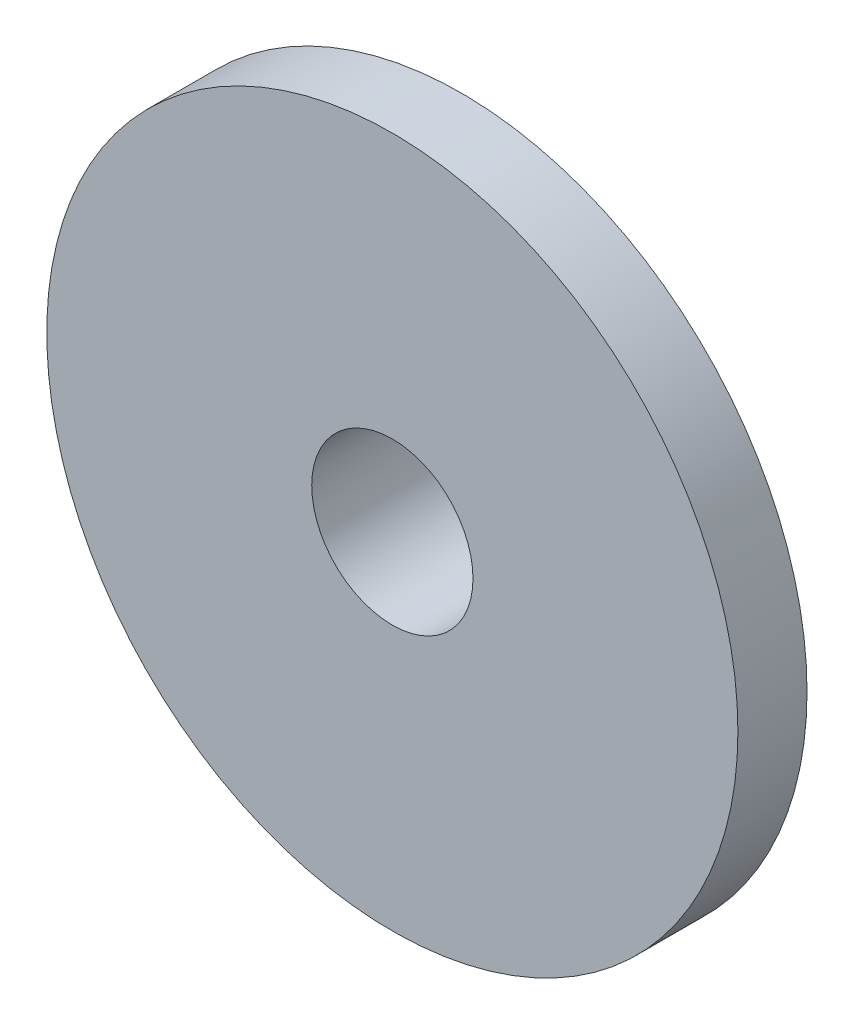
ISO-10303-21;
HEADER;
FILE_DESCRIPTION(('STEP AP214'),'2;1');
FILE_NAME('part.step','',(''),(''),'','','');
FILE_SCHEMA(('AUTOMOTIVE_DESIGN { 1 0 10303 214 1 1 1 1 }'));
ENDSEC;
DATA;
#1=APPLICATION_CONTEXT('core data for automotive mechanical design processes');
#2=APPLICATION_PROTOCOL_DEFINITION('international standard','automotive_design',2000,#1);
#3=PRODUCT_CONTEXT('',#1,'mechanical');
#4=PRODUCT('Part','Part','',(#3));
#5=PRODUCT_RELATED_PRODUCT_CATEGORY('part','',(#4));
#6=PRODUCT_DEFINITION_FORMATION('','',#4);
#7=PRODUCT_DEFINITION_CONTEXT('part definition',#1,'design');
#8=PRODUCT_DEFINITION('design','',#6,#7);
#9=PRODUCT_DEFINITION_SHAPE('','',#8);
#10=(LENGTH_UNIT() NAMED_UNIT(*) SI_UNIT(.MILLI.,.METRE.));
#11=(NAMED_UNIT(*) PLANE_ANGLE_UNIT() SI_UNIT($,.RADIAN.));
#12=(NAMED_UNIT(*) SI_UNIT($,.STERADIAN.) SOLID_ANGLE_UNIT());
#13=UNCERTAINTY_MEASURE_WITH_UNIT(LENGTH_MEASURE(1.E-05),#10,'distance_accuracy_value','');
#14=(GEOMETRIC_REPRESENTATION_CONTEXT(3) GLOBAL_UNCERTAINTY_ASSIGNED_CONTEXT((#13)) GLOBAL_UNIT_ASSIGNED_CONTEXT((#10,
#11,#12)) REPRESENTATION_CONTEXT('',''));
#15=CARTESIAN_POINT('',(0.,0.,0.));
#16=DIRECTION('',(0.,0.,1.));
#17=DIRECTION('',(1.,0.,0.));
#18=AXIS2_PLACEMENT_3D('',#15,#16,#17);
#19=CARTESIAN_POINT('',(-0.860205171589579,39.9907495186422,0.));
#20=DIRECTION('',(0.,0.,1.));
#21=DIRECTION('',(1.,0.,0.));
#22=AXIS2_PLACEMENT_3D('',#19,#20,#21);
#23=PLANE('',#22);
#24=CARTESIAN_POINT('',(-0.860205171589579,39.9907495186422,0.));
#25=DIRECTION('',(0.,0.,1.));
#26=DIRECTION('',(1.,0.,0.));
#27=AXIS2_PLACEMENT_3D('',#24,#25,#26);
#28=CIRCLE('',#27,15.);
#29=CARTESIAN_POINT('',(14.1397948284104,39.9907495186422,0.));
#30=VERTEX_POINT('',#29);
#31=EDGE_CURVE('E54',#30,#30,#28,.T.);
#32=ORIENTED_EDGE('',*,*,#31,.F.);
#33=EDGE_LOOP('',(#32));
#34=FACE_BOUND('',#33,.T.);
#35=CARTESIAN_POINT('',(-0.860205171589579,39.9907495186422,0.));
#36=DIRECTION('',(0.,0.,1.));
#37=DIRECTION('',(1.,0.,0.));
#38=AXIS2_PLACEMENT_3D('',#35,#36,#37);
#39=CIRCLE('',#38,4.);
#40=CARTESIAN_POINT('',(3.13979482841042,39.9907495186422,0.));
#41=VERTEX_POINT('',#40);
#42=EDGE_CURVE('E10',#41,#41,#39,.F.);
#43=ORIENTED_EDGE('',*,*,#42,.F.);
#44=EDGE_LOOP('',(#43));
#45=FACE_BOUND('',#44,.T.);
#46=ADVANCED_FACE('F41',(#34,#45),#23,.F.);
#47=CARTESIAN_POINT('',(-0.860205171589579,39.9907495186422,3.));
#48=DIRECTION('',(0.,0.,1.));
#49=DIRECTION('',(1.,0.,0.));
#50=AXIS2_PLACEMENT_3D('',#47,#48,#49);
#51=PLANE('',#50);
#52=CARTESIAN_POINT('',(-0.860205171589579,39.9907495186422,3.));
#53=DIRECTION('',(0.,0.,1.));
#54=DIRECTION('',(1.,0.,0.));
#55=AXIS2_PLACEMENT_3D('',#52,#53,#54);
#56=CIRCLE('',#55,15.);
#57=CARTESIAN_POINT('',(14.1397948284104,39.9907495186422,3.));
#58=VERTEX_POINT('',#57);
#59=EDGE_CURVE('E49',#58,#58,#56,.T.);
#60=ORIENTED_EDGE('',*,*,#59,.T.);
#61=EDGE_LOOP('',(#60));
#62=FACE_BOUND('',#61,.T.);
#63=CARTESIAN_POINT('',(-0.860205171589579,39.9907495186422,3.));
#64=DIRECTION('',(0.,0.,1.));
#65=DIRECTION('',(1.,0.,0.));
#66=AXIS2_PLACEMENT_3D('',#63,#64,#65);
#67=CIRCLE('',#66,3.5);
#68=CARTESIAN_POINT('',(2.63979482841042,39.9907495186422,3.));
#69=VERTEX_POINT('',#68);
#70=EDGE_CURVE('E60',#69,#69,#67,.T.);
#71=ORIENTED_EDGE('',*,*,#70,.F.);
#72=EDGE_LOOP('',(#71));
#73=FACE_BOUND('',#72,.T.);
#74=ADVANCED_FACE('F90',(#62,#73),#51,.T.);
#75=CARTESIAN_POINT('',(-0.860205171589579,39.9907495186422,3.));
#76=DIRECTION('',(0.,0.,-1.));
#77=DIRECTION('',(-1.,0.,0.));
#78=AXIS2_PLACEMENT_3D('',#75,#76,#77);
#79=CYLINDRICAL_SURFACE('',#78,15.);
#80=ORIENTED_EDGE('',*,*,#59,.F.);
#81=EDGE_LOOP('',(#80));
#82=FACE_BOUND('',#81,.T.);
#83=ORIENTED_EDGE('',*,*,#31,.T.);
#84=EDGE_LOOP('',(#83));
#85=FACE_BOUND('',#84,.T.);
#86=ADVANCED_FACE('F43',(#82,#85),#79,.T.);
#87=CARTESIAN_POINT('',(-0.860205171589579,39.9907495186422,3.));
#88=DIRECTION('',(0.,0.,-1.));
#89=DIRECTION('',(-1.,0.,0.));
#90=AXIS2_PLACEMENT_3D('',#87,#88,#89);
#91=CYLINDRICAL_SURFACE('',#90,3.5);
#92=ORIENTED_EDGE('',*,*,#70,.T.);
#93=EDGE_LOOP('',(#92));
#94=FACE_BOUND('',#93,.T.);
#95=CARTESIAN_POINT('',(-0.860205171589579,39.9907495186422,-5.));
#96=DIRECTION('',(0.,0.,-1.));
#97=DIRECTION('',(-1.,0.,0.));
#98=AXIS2_PLACEMENT_3D('',#95,#96,#97);
#99=CIRCLE('',#98,3.5);
#100=CARTESIAN_POINT('',(-4.36020517158958,39.9907495186422,-5.));
#101=VERTEX_POINT('',#100);
#102=EDGE_CURVE('E69',#101,#101,#99,.T.);
#103=ORIENTED_EDGE('',*,*,#102,.T.);
#104=EDGE_LOOP('',(#103));
#105=FACE_BOUND('',#104,.T.);
#106=ADVANCED_FACE('F74',(#94,#105),#91,.F.);
#107=CARTESIAN_POINT('',(-0.860205171589579,39.9907495186422,-5.));
#108=DIRECTION('',(0.,0.,-1.));
#109=DIRECTION('',(-1.,0.,0.));
#110=AXIS2_PLACEMENT_3D('',#107,#108,#109);
#111=PLANE('',#110);
#112=CARTESIAN_POINT('',(-0.860205171589579,39.9907495186422,-5.));
#113=DIRECTION('',(0.,0.,-1.));
#114=DIRECTION('',(-1.,0.,0.));
#115=AXIS2_PLACEMENT_3D('',#112,#113,#114);
#116=CIRCLE('',#115,4.);
#117=CARTESIAN_POINT('',(-4.86020517158958,39.9907495186422,-5.));
#118=VERTEX_POINT('',#117);
#119=EDGE_CURVE('E65',#118,#118,#116,.T.);
#120=ORIENTED_EDGE('',*,*,#119,.T.);
#121=EDGE_LOOP('',(#120));
#122=FACE_BOUND('',#121,.T.);
#123=ORIENTED_EDGE('',*,*,#102,.F.);
#124=EDGE_LOOP('',(#123));
#125=FACE_BOUND('',#124,.T.);
#126=ADVANCED_FACE('F76',(#122,#125),#111,.T.);
#127=CARTESIAN_POINT('',(-0.860205171589579,39.9907495186422,-5.));
#128=DIRECTION('',(0.,0.,1.));
#129=DIRECTION('',(1.,0.,0.));
#130=AXIS2_PLACEMENT_3D('',#127,#128,#129);
#131=CYLINDRICAL_SURFACE('',#130,4.);
#132=ORIENTED_EDGE('',*,*,#119,.F.);
#133=EDGE_LOOP('',(#132));
#134=FACE_BOUND('',#133,.T.);
#135=ORIENTED_EDGE('',*,*,#42,.T.);
#136=EDGE_LOOP('',(#135));
#137=FACE_BOUND('',#136,.T.);
#138=ADVANCED_FACE('F78',(#134,#137),#131,.T.);
#139=CLOSED_SHELL('',(#46,#74,#86,#106,#126,#138));
#140=MANIFOLD_SOLID_BREP('B2',#139);
#141=ADVANCED_BREP_SHAPE_REPRESENTATION('',(#18,#140),#14);
#142=SHAPE_DEFINITION_REPRESENTATION(#9,#141);
ENDSEC;
END-ISO-10303-21;
